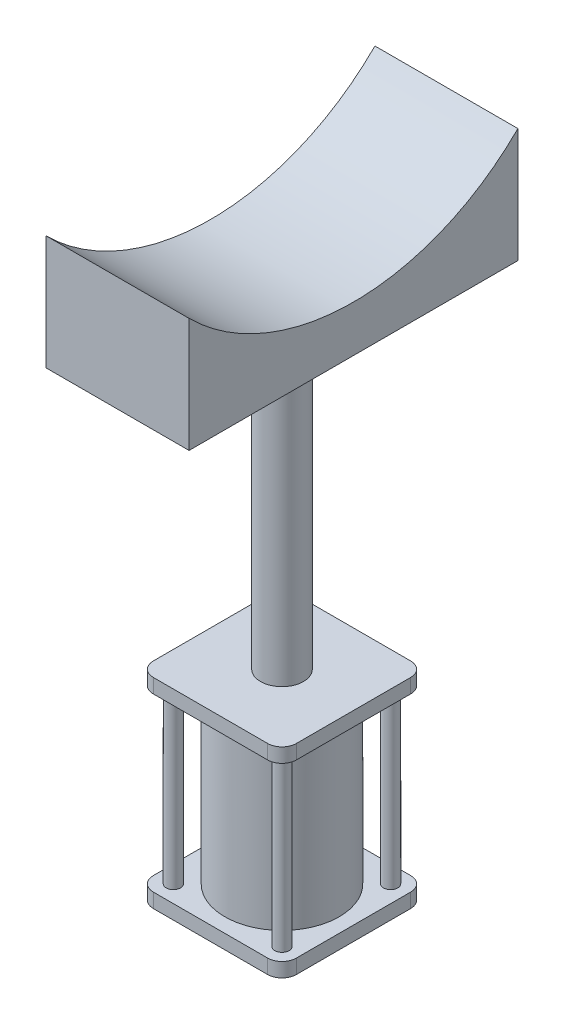
ISO-10303-21;
HEADER;
FILE_DESCRIPTION(('STEP AP214'),'2;1');
FILE_NAME('part.step','',(''),(''),'','','');
FILE_SCHEMA(('AUTOMOTIVE_DESIGN { 1 0 10303 214 1 1 1 1 }'));
ENDSEC;
DATA;
#1=APPLICATION_CONTEXT('core data for automotive mechanical design processes');
#2=APPLICATION_PROTOCOL_DEFINITION('international standard','automotive_design',2000,#1);
#3=PRODUCT_CONTEXT('',#1,'mechanical');
#4=PRODUCT('Part','Part','',(#3));
#5=PRODUCT_RELATED_PRODUCT_CATEGORY('part','',(#4));
#6=PRODUCT_DEFINITION_FORMATION('','',#4);
#7=PRODUCT_DEFINITION_CONTEXT('part definition',#1,'design');
#8=PRODUCT_DEFINITION('design','',#6,#7);
#9=PRODUCT_DEFINITION_SHAPE('','',#8);
#10=(LENGTH_UNIT() NAMED_UNIT(*) SI_UNIT(.MILLI.,.METRE.));
#11=(NAMED_UNIT(*) PLANE_ANGLE_UNIT() SI_UNIT($,.RADIAN.));
#12=(NAMED_UNIT(*) SI_UNIT($,.STERADIAN.) SOLID_ANGLE_UNIT());
#13=UNCERTAINTY_MEASURE_WITH_UNIT(LENGTH_MEASURE(1.E-05),#10,'distance_accuracy_value','');
#14=(GEOMETRIC_REPRESENTATION_CONTEXT(3) GLOBAL_UNCERTAINTY_ASSIGNED_CONTEXT((#13)) GLOBAL_UNIT_ASSIGNED_CONTEXT((#10,
#11,#12)) REPRESENTATION_CONTEXT('',''));
#15=CARTESIAN_POINT('',(0.,0.,0.));
#16=DIRECTION('',(0.,0.,1.));
#17=DIRECTION('',(1.,0.,0.));
#18=AXIS2_PLACEMENT_3D('',#15,#16,#17);
#19=CARTESIAN_POINT('',(0.,355.,0.));
#20=DIRECTION('',(0.,-1.,0.));
#21=DIRECTION('',(0.,0.,-1.));
#22=AXIS2_PLACEMENT_3D('',#19,#20,#21);
#23=CYLINDRICAL_SURFACE('',#22,15.);
#24=CARTESIAN_POINT('',(0.,355.,0.));
#25=DIRECTION('',(0.,1.,0.));
#26=DIRECTION('',(0.,0.,1.));
#27=AXIS2_PLACEMENT_3D('',#24,#25,#26);
#28=CIRCLE('',#27,15.);
#29=CARTESIAN_POINT('',(0.,355.,15.));
#30=VERTEX_POINT('',#29);
#31=EDGE_CURVE('E12',#30,#30,#28,.T.);
#32=ORIENTED_EDGE('',*,*,#31,.F.);
#33=EDGE_LOOP('',(#32));
#34=FACE_BOUND('',#33,.T.);
#35=CARTESIAN_POINT('',(0.,140.,0.));
#36=DIRECTION('',(0.,1.,0.));
#37=DIRECTION('',(0.,0.,1.));
#38=AXIS2_PLACEMENT_3D('',#35,#36,#37);
#39=CIRCLE('',#38,15.);
#40=CARTESIAN_POINT('',(0.,140.,15.));
#41=VERTEX_POINT('',#40);
#42=EDGE_CURVE('E52',#41,#41,#39,.T.);
#43=ORIENTED_EDGE('',*,*,#42,.T.);
#44=EDGE_LOOP('',(#43));
#45=FACE_BOUND('',#44,.T.);
#46=ADVANCED_FACE('F49',(#34,#45),#23,.T.);
#47=CARTESIAN_POINT('',(0.,140.,0.));
#48=DIRECTION('',(0.,1.,0.));
#49=DIRECTION('',(0.,0.,1.));
#50=AXIS2_PLACEMENT_3D('',#47,#48,#49);
#51=PLANE('',#50);
#52=ORIENTED_EDGE('',*,*,#42,.F.);
#53=EDGE_LOOP('',(#52));
#54=FACE_BOUND('',#53,.T.);
#55=ADVANCED_FACE('F141',(#54),#51,.F.);
#56=CARTESIAN_POINT('',(-50.,550.,0.));
#57=DIRECTION('',(1.,0.,0.));
#58=DIRECTION('',(0.,0.,-1.));
#59=AXIS2_PLACEMENT_3D('',#56,#57,#58);
#60=CYLINDRICAL_SURFACE('',#59,162.634559672906);
#61=DIRECTION('',(1.,0.,0.));
#62=VECTOR('',#61,1.);
#63=CARTESIAN_POINT('',(-50.,435.,115.));
#64=LINE('',#63,#62);
#65=CARTESIAN_POINT('',(-50.,435.,115.));
#66=VERTEX_POINT('',#65);
#67=CARTESIAN_POINT('',(50.,435.,115.));
#68=VERTEX_POINT('',#67);
#69=EDGE_CURVE('E89',#66,#68,#64,.T.);
#70=ORIENTED_EDGE('',*,*,#69,.T.);
#71=CARTESIAN_POINT('',(50.,550.,0.));
#72=DIRECTION('',(-1.,0.,0.));
#73=DIRECTION('',(0.,0.,-1.));
#74=AXIS2_PLACEMENT_3D('',#71,#72,#73);
#75=CIRCLE('',#74,162.634559672906);
#76=CARTESIAN_POINT('',(50.,435.,-115.));
#77=VERTEX_POINT('',#76);
#78=EDGE_CURVE('E93',#77,#68,#75,.T.);
#79=ORIENTED_EDGE('',*,*,#78,.F.);
#80=DIRECTION('',(1.,0.,0.));
#81=VECTOR('',#80,1.);
#82=CARTESIAN_POINT('',(-50.,435.,-115.));
#83=LINE('',#82,#81);
#84=CARTESIAN_POINT('',(-50.,435.,-115.));
#85=VERTEX_POINT('',#84);
#86=EDGE_CURVE('E64',#85,#77,#83,.T.);
#87=ORIENTED_EDGE('',*,*,#86,.F.);
#88=CARTESIAN_POINT('',(-50.,550.,0.));
#89=DIRECTION('',(-1.,0.,0.));
#90=DIRECTION('',(0.,0.,-1.));
#91=AXIS2_PLACEMENT_3D('',#88,#89,#90);
#92=CIRCLE('',#91,162.634559672906);
#93=EDGE_CURVE('E94',#85,#66,#92,.T.);
#94=ORIENTED_EDGE('',*,*,#93,.T.);
#95=EDGE_LOOP('',(#70,#79,#87,#94));
#96=FACE_BOUND('',#95,.T.);
#97=ADVANCED_FACE('F91',(#96),#60,.F.);
#98=CARTESIAN_POINT('',(-50.,435.,-115.));
#99=DIRECTION('',(0.,0.,-1.));
#100=DIRECTION('',(0.,1.,0.));
#101=AXIS2_PLACEMENT_3D('',#98,#99,#100);
#102=PLANE('',#101);
#103=ORIENTED_EDGE('',*,*,#86,.T.);
#104=DIRECTION('',(0.,1.,0.));
#105=VECTOR('',#104,1.);
#106=CARTESIAN_POINT('',(50.,435.,-115.));
#107=LINE('',#106,#105);
#108=CARTESIAN_POINT('',(50.,355.,-115.));
#109=VERTEX_POINT('',#108);
#110=EDGE_CURVE('E113',#109,#77,#107,.T.);
#111=ORIENTED_EDGE('',*,*,#110,.F.);
#112=DIRECTION('',(1.,0.,0.));
#113=VECTOR('',#112,1.);
#114=CARTESIAN_POINT('',(-50.,355.,-115.));
#115=LINE('',#114,#113);
#116=CARTESIAN_POINT('',(-50.,355.,-115.));
#117=VERTEX_POINT('',#116);
#118=EDGE_CURVE('E72',#117,#109,#115,.T.);
#119=ORIENTED_EDGE('',*,*,#118,.F.);
#120=DIRECTION('',(0.,1.,0.));
#121=VECTOR('',#120,1.);
#122=CARTESIAN_POINT('',(-50.,435.,-115.));
#123=LINE('',#122,#121);
#124=EDGE_CURVE('E100',#117,#85,#123,.T.);
#125=ORIENTED_EDGE('',*,*,#124,.T.);
#126=EDGE_LOOP('',(#103,#111,#119,#125));
#127=FACE_BOUND('',#126,.T.);
#128=ADVANCED_FACE('F147',(#127),#102,.T.);
#129=CARTESIAN_POINT('',(-50.,355.,115.));
#130=DIRECTION('',(0.,-1.,0.));
#131=DIRECTION('',(0.,0.,-1.));
#132=AXIS2_PLACEMENT_3D('',#129,#130,#131);
#133=PLANE('',#132);
#134=ORIENTED_EDGE('',*,*,#31,.T.);
#135=EDGE_LOOP('',(#134));
#136=FACE_BOUND('',#135,.T.);
#137=ORIENTED_EDGE('',*,*,#118,.T.);
#138=DIRECTION('',(0.,0.,-1.));
#139=VECTOR('',#138,1.);
#140=CARTESIAN_POINT('',(50.,355.,115.));
#141=LINE('',#140,#139);
#142=CARTESIAN_POINT('',(50.,355.,115.));
#143=VERTEX_POINT('',#142);
#144=EDGE_CURVE('E109',#143,#109,#141,.T.);
#145=ORIENTED_EDGE('',*,*,#144,.F.);
#146=DIRECTION('',(1.,0.,0.));
#147=VECTOR('',#146,1.);
#148=CARTESIAN_POINT('',(-50.,355.,115.));
#149=LINE('',#148,#147);
#150=CARTESIAN_POINT('',(-50.,355.,115.));
#151=VERTEX_POINT('',#150);
#152=EDGE_CURVE('E99',#151,#143,#149,.T.);
#153=ORIENTED_EDGE('',*,*,#152,.F.);
#154=DIRECTION('',(0.,0.,-1.));
#155=VECTOR('',#154,1.);
#156=CARTESIAN_POINT('',(-50.,355.,115.));
#157=LINE('',#156,#155);
#158=EDGE_CURVE('E126',#151,#117,#157,.T.);
#159=ORIENTED_EDGE('',*,*,#158,.T.);
#160=EDGE_LOOP('',(#137,#145,#153,#159));
#161=FACE_BOUND('',#160,.T.);
#162=ADVANCED_FACE('F154',(#136,#161),#133,.T.);
#163=CARTESIAN_POINT('',(-50.,435.,115.));
#164=DIRECTION('',(0.,0.,1.));
#165=DIRECTION('',(0.,-1.,0.));
#166=AXIS2_PLACEMENT_3D('',#163,#164,#165);
#167=PLANE('',#166);
#168=ORIENTED_EDGE('',*,*,#152,.T.);
#169=DIRECTION('',(0.,-1.,0.));
#170=VECTOR('',#169,1.);
#171=CARTESIAN_POINT('',(50.,435.,115.));
#172=LINE('',#171,#170);
#173=EDGE_CURVE('E103',#68,#143,#172,.T.);
#174=ORIENTED_EDGE('',*,*,#173,.F.);
#175=ORIENTED_EDGE('',*,*,#69,.F.);
#176=DIRECTION('',(0.,-1.,0.));
#177=VECTOR('',#176,1.);
#178=CARTESIAN_POINT('',(-50.,435.,115.));
#179=LINE('',#178,#177);
#180=EDGE_CURVE('E123',#66,#151,#179,.T.);
#181=ORIENTED_EDGE('',*,*,#180,.T.);
#182=EDGE_LOOP('',(#168,#174,#175,#181));
#183=FACE_BOUND('',#182,.T.);
#184=ADVANCED_FACE('F104',(#183),#167,.T.);
#185=CARTESIAN_POINT('',(-50.,550.,0.));
#186=DIRECTION('',(1.,0.,0.));
#187=DIRECTION('',(0.,0.,-1.));
#188=AXIS2_PLACEMENT_3D('',#185,#186,#187);
#189=PLANE('',#188);
#190=ORIENTED_EDGE('',*,*,#93,.F.);
#191=ORIENTED_EDGE('',*,*,#124,.F.);
#192=ORIENTED_EDGE('',*,*,#158,.F.);
#193=ORIENTED_EDGE('',*,*,#180,.F.);
#194=EDGE_LOOP('',(#190,#191,#192,#193));
#195=FACE_BOUND('',#194,.T.);
#196=ADVANCED_FACE('F153',(#195),#189,.F.);
#197=CARTESIAN_POINT('',(50.,550.,0.));
#198=DIRECTION('',(1.,0.,0.));
#199=DIRECTION('',(0.,0.,-1.));
#200=AXIS2_PLACEMENT_3D('',#197,#198,#199);
#201=PLANE('',#200);
#202=ORIENTED_EDGE('',*,*,#78,.T.);
#203=ORIENTED_EDGE('',*,*,#173,.T.);
#204=ORIENTED_EDGE('',*,*,#144,.T.);
#205=ORIENTED_EDGE('',*,*,#110,.T.);
#206=EDGE_LOOP('',(#202,#203,#204,#205));
#207=FACE_BOUND('',#206,.T.);
#208=ADVANCED_FACE('F112',(#207),#201,.T.);
#209=CLOSED_SHELL('',(#46,#55,#97,#128,#162,#184,#196,#208));
#210=MANIFOLD_SOLID_BREP('B2',#209);
#211=CARTESIAN_POINT('',(50.,10.,50.));
#212=DIRECTION('',(-1.,0.,0.));
#213=DIRECTION('',(0.,0.,1.));
#214=AXIS2_PLACEMENT_3D('',#211,#212,#213);
#215=PLANE('',#214);
#216=DIRECTION('',(0.,0.,-1.));
#217=VECTOR('',#216,1.);
#218=CARTESIAN_POINT('',(50.,0.,50.));
#219=LINE('',#218,#217);
#220=CARTESIAN_POINT('',(50.,0.,40.));
#221=VERTEX_POINT('',#220);
#222=CARTESIAN_POINT('',(50.,0.,-40.));
#223=VERTEX_POINT('',#222);
#224=EDGE_CURVE('E358',#221,#223,#219,.T.);
#225=ORIENTED_EDGE('',*,*,#224,.T.);
#226=DIRECTION('',(0.,-1.,0.));
#227=VECTOR('',#226,1.);
#228=CARTESIAN_POINT('',(50.,10.,-40.));
#229=LINE('',#228,#227);
#230=CARTESIAN_POINT('',(50.,10.,-40.));
#231=VERTEX_POINT('',#230);
#232=EDGE_CURVE('E336',#223,#231,#229,.F.);
#233=ORIENTED_EDGE('',*,*,#232,.T.);
#234=DIRECTION('',(0.,0.,-1.));
#235=VECTOR('',#234,1.);
#236=CARTESIAN_POINT('',(50.,10.,50.));
#237=LINE('',#236,#235);
#238=CARTESIAN_POINT('',(50.,10.,40.));
#239=VERTEX_POINT('',#238);
#240=EDGE_CURVE('E369',#239,#231,#237,.T.);
#241=ORIENTED_EDGE('',*,*,#240,.F.);
#242=DIRECTION('',(0.,-1.,0.));
#243=VECTOR('',#242,1.);
#244=CARTESIAN_POINT('',(50.,10.,40.));
#245=LINE('',#244,#243);
#246=EDGE_CURVE('E341',#239,#221,#245,.T.);
#247=ORIENTED_EDGE('',*,*,#246,.T.);
#248=EDGE_LOOP('',(#225,#233,#241,#247));
#249=FACE_BOUND('',#248,.T.);
#250=ADVANCED_FACE('F217',(#249),#215,.F.);
#251=CARTESIAN_POINT('',(-50.,10.,-50.));
#252=DIRECTION('',(0.,0.,1.));
#253=DIRECTION('',(1.,0.,0.));
#254=AXIS2_PLACEMENT_3D('',#251,#252,#253);
#255=PLANE('',#254);
#256=DIRECTION('',(-1.,0.,0.));
#257=VECTOR('',#256,1.);
#258=CARTESIAN_POINT('',(-50.,10.,-50.));
#259=LINE('',#258,#257);
#260=CARTESIAN_POINT('',(40.,10.,-50.));
#261=VERTEX_POINT('',#260);
#262=CARTESIAN_POINT('',(-40.,10.,-50.));
#263=VERTEX_POINT('',#262);
#264=EDGE_CURVE('E351',#261,#263,#259,.T.);
#265=ORIENTED_EDGE('',*,*,#264,.F.);
#266=DIRECTION('',(0.,-1.,0.));
#267=VECTOR('',#266,1.);
#268=CARTESIAN_POINT('',(40.,10.,-50.));
#269=LINE('',#268,#267);
#270=CARTESIAN_POINT('',(40.,0.,-50.));
#271=VERTEX_POINT('',#270);
#272=EDGE_CURVE('E335',#261,#271,#269,.T.);
#273=ORIENTED_EDGE('',*,*,#272,.T.);
#274=DIRECTION('',(-1.,0.,0.));
#275=VECTOR('',#274,1.);
#276=CARTESIAN_POINT('',(-50.,0.,-50.));
#277=LINE('',#276,#275);
#278=CARTESIAN_POINT('',(-40.,0.,-50.));
#279=VERTEX_POINT('',#278);
#280=EDGE_CURVE('E348',#271,#279,#277,.T.);
#281=ORIENTED_EDGE('',*,*,#280,.T.);
#282=DIRECTION('',(0.,-1.,0.));
#283=VECTOR('',#282,1.);
#284=CARTESIAN_POINT('',(-40.,10.,-50.));
#285=LINE('',#284,#283);
#286=EDGE_CURVE('E353',#279,#263,#285,.F.);
#287=ORIENTED_EDGE('',*,*,#286,.T.);
#288=EDGE_LOOP('',(#265,#273,#281,#287));
#289=FACE_BOUND('',#288,.T.);
#290=ADVANCED_FACE('F347',(#289),#255,.F.);
#291=CARTESIAN_POINT('',(-50.,10.,50.));
#292=DIRECTION('',(1.,0.,0.));
#293=DIRECTION('',(0.,0.,-1.));
#294=AXIS2_PLACEMENT_3D('',#291,#292,#293);
#295=PLANE('',#294);
#296=DIRECTION('',(0.,0.,1.));
#297=VECTOR('',#296,1.);
#298=CARTESIAN_POINT('',(-50.,0.,50.));
#299=LINE('',#298,#297);
#300=CARTESIAN_POINT('',(-50.,0.,-40.));
#301=VERTEX_POINT('',#300);
#302=CARTESIAN_POINT('',(-50.,0.,40.));
#303=VERTEX_POINT('',#302);
#304=EDGE_CURVE('E357',#301,#303,#299,.T.);
#305=ORIENTED_EDGE('',*,*,#304,.T.);
#306=DIRECTION('',(0.,-1.,0.));
#307=VECTOR('',#306,1.);
#308=CARTESIAN_POINT('',(-50.,10.,40.));
#309=LINE('',#308,#307);
#310=CARTESIAN_POINT('',(-50.,10.,40.));
#311=VERTEX_POINT('',#310);
#312=EDGE_CURVE('E419',#303,#311,#309,.F.);
#313=ORIENTED_EDGE('',*,*,#312,.T.);
#314=DIRECTION('',(0.,0.,1.));
#315=VECTOR('',#314,1.);
#316=CARTESIAN_POINT('',(-50.,10.,50.));
#317=LINE('',#316,#315);
#318=CARTESIAN_POINT('',(-50.,10.,-40.));
#319=VERTEX_POINT('',#318);
#320=EDGE_CURVE('E486',#319,#311,#317,.T.);
#321=ORIENTED_EDGE('',*,*,#320,.F.);
#322=DIRECTION('',(0.,-1.,0.));
#323=VECTOR('',#322,1.);
#324=CARTESIAN_POINT('',(-50.,10.,-40.));
#325=LINE('',#324,#323);
#326=EDGE_CURVE('E416',#319,#301,#325,.T.);
#327=ORIENTED_EDGE('',*,*,#326,.T.);
#328=EDGE_LOOP('',(#305,#313,#321,#327));
#329=FACE_BOUND('',#328,.T.);
#330=ADVANCED_FACE('F508',(#329),#295,.F.);
#331=CARTESIAN_POINT('',(-50.,10.,50.));
#332=DIRECTION('',(0.,0.,-1.));
#333=DIRECTION('',(-1.,0.,0.));
#334=AXIS2_PLACEMENT_3D('',#331,#332,#333);
#335=PLANE('',#334);
#336=DIRECTION('',(1.,0.,0.));
#337=VECTOR('',#336,1.);
#338=CARTESIAN_POINT('',(-50.,0.,50.));
#339=LINE('',#338,#337);
#340=CARTESIAN_POINT('',(-40.,0.,50.));
#341=VERTEX_POINT('',#340);
#342=CARTESIAN_POINT('',(40.,0.,50.));
#343=VERTEX_POINT('',#342);
#344=EDGE_CURVE('E361',#341,#343,#339,.T.);
#345=ORIENTED_EDGE('',*,*,#344,.T.);
#346=DIRECTION('',(0.,-1.,0.));
#347=VECTOR('',#346,1.);
#348=CARTESIAN_POINT('',(40.,10.,50.));
#349=LINE('',#348,#347);
#350=CARTESIAN_POINT('',(40.,10.,50.));
#351=VERTEX_POINT('',#350);
#352=EDGE_CURVE('E414',#343,#351,#349,.F.);
#353=ORIENTED_EDGE('',*,*,#352,.T.);
#354=DIRECTION('',(1.,0.,0.));
#355=VECTOR('',#354,1.);
#356=CARTESIAN_POINT('',(-50.,10.,50.));
#357=LINE('',#356,#355);
#358=CARTESIAN_POINT('',(-40.,10.,50.));
#359=VERTEX_POINT('',#358);
#360=EDGE_CURVE('E374',#359,#351,#357,.T.);
#361=ORIENTED_EDGE('',*,*,#360,.F.);
#362=DIRECTION('',(0.,-1.,0.));
#363=VECTOR('',#362,1.);
#364=CARTESIAN_POINT('',(-40.,10.,50.));
#365=LINE('',#364,#363);
#366=EDGE_CURVE('E411',#359,#341,#365,.T.);
#367=ORIENTED_EDGE('',*,*,#366,.T.);
#368=EDGE_LOOP('',(#345,#353,#361,#367));
#369=FACE_BOUND('',#368,.T.);
#370=ADVANCED_FACE('F503',(#369),#335,.F.);
#371=CARTESIAN_POINT('',(0.,10.,0.));
#372=DIRECTION('',(0.,-1.,0.));
#373=DIRECTION('',(0.,0.,-1.));
#374=AXIS2_PLACEMENT_3D('',#371,#372,#373);
#375=PLANE('',#374);
#376=CARTESIAN_POINT('',(-38.,10.,38.));
#377=DIRECTION('',(0.,-1.,0.));
#378=DIRECTION('',(0.,0.,-1.));
#379=AXIS2_PLACEMENT_3D('',#376,#377,#378);
#380=CIRCLE('',#379,5.);
#381=CARTESIAN_POINT('',(-38.,10.,33.));
#382=VERTEX_POINT('',#381);
#383=EDGE_CURVE('E392',#382,#382,#380,.F.);
#384=ORIENTED_EDGE('',*,*,#383,.F.);
#385=EDGE_LOOP('',(#384));
#386=FACE_BOUND('',#385,.T.);
#387=CARTESIAN_POINT('',(38.,10.,38.));
#388=DIRECTION('',(0.,-1.,0.));
#389=DIRECTION('',(0.,0.,-1.));
#390=AXIS2_PLACEMENT_3D('',#387,#388,#389);
#391=CIRCLE('',#390,5.);
#392=CARTESIAN_POINT('',(38.,10.,33.));
#393=VERTEX_POINT('',#392);
#394=EDGE_CURVE('E386',#393,#393,#391,.F.);
#395=ORIENTED_EDGE('',*,*,#394,.F.);
#396=EDGE_LOOP('',(#395));
#397=FACE_BOUND('',#396,.T.);
#398=CARTESIAN_POINT('',(38.,10.,-38.));
#399=DIRECTION('',(0.,-1.,0.));
#400=DIRECTION('',(0.,0.,-1.));
#401=AXIS2_PLACEMENT_3D('',#398,#399,#400);
#402=CIRCLE('',#401,5.);
#403=CARTESIAN_POINT('',(38.,10.,-43.));
#404=VERTEX_POINT('',#403);
#405=EDGE_CURVE('E380',#404,#404,#402,.F.);
#406=ORIENTED_EDGE('',*,*,#405,.F.);
#407=EDGE_LOOP('',(#406));
#408=FACE_BOUND('',#407,.T.);
#409=CARTESIAN_POINT('',(0.,9.99999999999999,0.));
#410=DIRECTION('',(0.,-1.,0.));
#411=DIRECTION('',(0.,0.,-1.));
#412=AXIS2_PLACEMENT_3D('',#409,#410,#411);
#413=CIRCLE('',#412,40.);
#414=CARTESIAN_POINT('',(0.,9.99999999999999,-40.));
#415=VERTEX_POINT('',#414);
#416=EDGE_CURVE('E373',#415,#415,#413,.F.);
#417=ORIENTED_EDGE('',*,*,#416,.F.);
#418=EDGE_LOOP('',(#417));
#419=FACE_BOUND('',#418,.T.);
#420=CARTESIAN_POINT('',(-38.,10.,-38.));
#421=DIRECTION('',(0.,-1.,0.));
#422=DIRECTION('',(0.,0.,-1.));
#423=AXIS2_PLACEMENT_3D('',#420,#421,#422);
#424=CIRCLE('',#423,5.);
#425=CARTESIAN_POINT('',(-38.,10.,-43.));
#426=VERTEX_POINT('',#425);
#427=EDGE_CURVE('E370',#426,#426,#424,.F.);
#428=ORIENTED_EDGE('',*,*,#427,.F.);
#429=EDGE_LOOP('',(#428));
#430=FACE_BOUND('',#429,.T.);
#431=ORIENTED_EDGE('',*,*,#240,.T.);
#432=CARTESIAN_POINT('',(40.,10.,-40.));
#433=DIRECTION('',(0.,-1.,0.));
#434=DIRECTION('',(0.,0.,-1.));
#435=AXIS2_PLACEMENT_3D('',#432,#433,#434);
#436=CIRCLE('',#435,10.);
#437=EDGE_CURVE('E409',#231,#261,#436,.F.);
#438=ORIENTED_EDGE('',*,*,#437,.T.);
#439=ORIENTED_EDGE('',*,*,#264,.T.);
#440=CARTESIAN_POINT('',(-40.,10.,-40.));
#441=DIRECTION('',(0.,-1.,0.));
#442=DIRECTION('',(0.,0.,-1.));
#443=AXIS2_PLACEMENT_3D('',#440,#441,#442);
#444=CIRCLE('',#443,10.);
#445=EDGE_CURVE('E403',#263,#319,#444,.F.);
#446=ORIENTED_EDGE('',*,*,#445,.T.);
#447=ORIENTED_EDGE('',*,*,#320,.T.);
#448=CARTESIAN_POINT('',(-40.,10.,40.));
#449=DIRECTION('',(0.,-1.,0.));
#450=DIRECTION('',(0.,0.,-1.));
#451=AXIS2_PLACEMENT_3D('',#448,#449,#450);
#452=CIRCLE('',#451,10.);
#453=EDGE_CURVE('E405',#311,#359,#452,.F.);
#454=ORIENTED_EDGE('',*,*,#453,.T.);
#455=ORIENTED_EDGE('',*,*,#360,.T.);
#456=CARTESIAN_POINT('',(40.,10.,40.));
#457=DIRECTION('',(0.,-1.,0.));
#458=DIRECTION('',(0.,0.,-1.));
#459=AXIS2_PLACEMENT_3D('',#456,#457,#458);
#460=CIRCLE('',#459,10.);
#461=EDGE_CURVE('E407',#351,#239,#460,.F.);
#462=ORIENTED_EDGE('',*,*,#461,.T.);
#463=EDGE_LOOP('',(#431,#438,#439,#446,#447,#454,#455,#462));
#464=FACE_BOUND('',#463,.T.);
#465=ADVANCED_FACE('F492',(#386,#397,#408,#419,#430,#464),#375,.F.);
#466=CARTESIAN_POINT('',(0.,0.,0.));
#467=DIRECTION('',(0.,-1.,0.));
#468=DIRECTION('',(0.,0.,-1.));
#469=AXIS2_PLACEMENT_3D('',#466,#467,#468);
#470=PLANE('',#469);
#471=ORIENTED_EDGE('',*,*,#280,.F.);
#472=CARTESIAN_POINT('',(40.,0.,-40.));
#473=DIRECTION('',(0.,-1.,0.));
#474=DIRECTION('',(0.,0.,-1.));
#475=AXIS2_PLACEMENT_3D('',#472,#473,#474);
#476=CIRCLE('',#475,10.);
#477=EDGE_CURVE('E331',#271,#223,#476,.T.);
#478=ORIENTED_EDGE('',*,*,#477,.T.);
#479=ORIENTED_EDGE('',*,*,#224,.F.);
#480=CARTESIAN_POINT('',(40.,0.,40.));
#481=DIRECTION('',(0.,-1.,0.));
#482=DIRECTION('',(0.,0.,-1.));
#483=AXIS2_PLACEMENT_3D('',#480,#481,#482);
#484=CIRCLE('',#483,10.);
#485=EDGE_CURVE('E342',#221,#343,#484,.T.);
#486=ORIENTED_EDGE('',*,*,#485,.T.);
#487=ORIENTED_EDGE('',*,*,#344,.F.);
#488=CARTESIAN_POINT('',(-40.,0.,40.));
#489=DIRECTION('',(0.,-1.,0.));
#490=DIRECTION('',(0.,0.,-1.));
#491=AXIS2_PLACEMENT_3D('',#488,#489,#490);
#492=CIRCLE('',#491,10.);
#493=EDGE_CURVE('E397',#341,#303,#492,.T.);
#494=ORIENTED_EDGE('',*,*,#493,.T.);
#495=ORIENTED_EDGE('',*,*,#304,.F.);
#496=CARTESIAN_POINT('',(-40.,0.,-40.));
#497=DIRECTION('',(0.,-1.,0.));
#498=DIRECTION('',(0.,0.,-1.));
#499=AXIS2_PLACEMENT_3D('',#496,#497,#498);
#500=CIRCLE('',#499,10.);
#501=EDGE_CURVE('E352',#301,#279,#500,.T.);
#502=ORIENTED_EDGE('',*,*,#501,.T.);
#503=EDGE_LOOP('',(#471,#478,#479,#486,#487,#494,#495,#502));
#504=FACE_BOUND('',#503,.T.);
#505=ADVANCED_FACE('F355',(#504),#470,.T.);
#506=CARTESIAN_POINT('',(-38.,144.142135623731,-38.));
#507=DIRECTION('',(0.,-1.,0.));
#508=DIRECTION('',(0.,0.,-1.));
#509=AXIS2_PLACEMENT_3D('',#506,#507,#508);
#510=CYLINDRICAL_SURFACE('',#509,5.);
#511=ORIENTED_EDGE('',*,*,#427,.T.);
#512=EDGE_LOOP('',(#511));
#513=FACE_BOUND('',#512,.T.);
#514=CARTESIAN_POINT('',(-38.,130.,-38.));
#515=DIRECTION('',(0.,1.,0.));
#516=DIRECTION('',(0.,0.,1.));
#517=AXIS2_PLACEMENT_3D('',#514,#515,#516);
#518=CIRCLE('',#517,5.);
#519=CARTESIAN_POINT('',(-38.,130.,-33.));
#520=VERTEX_POINT('',#519);
#521=EDGE_CURVE('E363',#520,#520,#518,.T.);
#522=ORIENTED_EDGE('',*,*,#521,.F.);
#523=EDGE_LOOP('',(#522));
#524=FACE_BOUND('',#523,.T.);
#525=ADVANCED_FACE('F622',(#513,#524),#510,.T.);
#526=CARTESIAN_POINT('',(0.,130.,0.));
#527=DIRECTION('',(0.,-1.,0.));
#528=DIRECTION('',(0.,0.,-1.));
#529=AXIS2_PLACEMENT_3D('',#526,#527,#528);
#530=CYLINDRICAL_SURFACE('',#529,40.);
#531=CARTESIAN_POINT('',(0.,130.,0.));
#532=DIRECTION('',(0.,1.,0.));
#533=DIRECTION('',(0.,0.,1.));
#534=AXIS2_PLACEMENT_3D('',#531,#532,#533);
#535=CIRCLE('',#534,40.);
#536=CARTESIAN_POINT('',(0.,130.,40.));
#537=VERTEX_POINT('',#536);
#538=EDGE_CURVE('E477',#537,#537,#535,.T.);
#539=ORIENTED_EDGE('',*,*,#538,.F.);
#540=EDGE_LOOP('',(#539));
#541=FACE_BOUND('',#540,.T.);
#542=ORIENTED_EDGE('',*,*,#416,.T.);
#543=EDGE_LOOP('',(#542));
#544=FACE_BOUND('',#543,.T.);
#545=ADVANCED_FACE('F619',(#541,#544),#530,.T.);
#546=CARTESIAN_POINT('',(-50.,140.,-50.));
#547=DIRECTION('',(1.,0.,0.));
#548=DIRECTION('',(0.,0.,-1.));
#549=AXIS2_PLACEMENT_3D('',#546,#547,#548);
#550=PLANE('',#549);
#551=DIRECTION('',(0.,0.,1.));
#552=VECTOR('',#551,1.);
#553=CARTESIAN_POINT('',(-50.,140.,-50.));
#554=LINE('',#553,#552);
#555=CARTESIAN_POINT('',(-50.,140.,-40.));
#556=VERTEX_POINT('',#555);
#557=CARTESIAN_POINT('',(-50.,140.,40.));
#558=VERTEX_POINT('',#557);
#559=EDGE_CURVE('E476',#556,#558,#554,.T.);
#560=ORIENTED_EDGE('',*,*,#559,.F.);
#561=DIRECTION('',(0.,-1.,0.));
#562=VECTOR('',#561,1.);
#563=CARTESIAN_POINT('',(-50.,140.,-40.));
#564=LINE('',#563,#562);
#565=CARTESIAN_POINT('',(-50.,130.,-40.));
#566=VERTEX_POINT('',#565);
#567=EDGE_CURVE('E423',#556,#566,#564,.T.);
#568=ORIENTED_EDGE('',*,*,#567,.T.);
#569=DIRECTION('',(0.,0.,1.));
#570=VECTOR('',#569,1.);
#571=CARTESIAN_POINT('',(-50.,130.,-50.));
#572=LINE('',#571,#570);
#573=CARTESIAN_POINT('',(-50.,130.,40.));
#574=VERTEX_POINT('',#573);
#575=EDGE_CURVE('E467',#566,#574,#572,.T.);
#576=ORIENTED_EDGE('',*,*,#575,.T.);
#577=DIRECTION('',(0.,-1.,0.));
#578=VECTOR('',#577,1.);
#579=CARTESIAN_POINT('',(-50.,140.,40.));
#580=LINE('',#579,#578);
#581=EDGE_CURVE('E421',#574,#558,#580,.F.);
#582=ORIENTED_EDGE('',*,*,#581,.T.);
#583=EDGE_LOOP('',(#560,#568,#576,#582));
#584=FACE_BOUND('',#583,.T.);
#585=ADVANCED_FACE('F602',(#584),#550,.F.);
#586=CARTESIAN_POINT('',(-50.,140.,50.));
#587=DIRECTION('',(0.,0.,-1.));
#588=DIRECTION('',(-1.,0.,0.));
#589=AXIS2_PLACEMENT_3D('',#586,#587,#588);
#590=PLANE('',#589);
#591=DIRECTION('',(1.,0.,0.));
#592=VECTOR('',#591,1.);
#593=CARTESIAN_POINT('',(-50.,130.,50.));
#594=LINE('',#593,#592);
#595=CARTESIAN_POINT('',(-40.,130.,50.));
#596=VERTEX_POINT('',#595);
#597=CARTESIAN_POINT('',(40.,130.,50.));
#598=VERTEX_POINT('',#597);
#599=EDGE_CURVE('E456',#596,#598,#594,.T.);
#600=ORIENTED_EDGE('',*,*,#599,.T.);
#601=DIRECTION('',(0.,-1.,0.));
#602=VECTOR('',#601,1.);
#603=CARTESIAN_POINT('',(40.,140.,50.));
#604=LINE('',#603,#602);
#605=CARTESIAN_POINT('',(40.,140.,50.));
#606=VERTEX_POINT('',#605);
#607=EDGE_CURVE('E47',#598,#606,#604,.F.);
#608=ORIENTED_EDGE('',*,*,#607,.T.);
#609=DIRECTION('',(1.,0.,0.));
#610=VECTOR('',#609,1.);
#611=CARTESIAN_POINT('',(-50.,140.,50.));
#612=LINE('',#611,#610);
#613=CARTESIAN_POINT('',(-40.,140.,50.));
#614=VERTEX_POINT('',#613);
#615=EDGE_CURVE('E458',#614,#606,#612,.T.);
#616=ORIENTED_EDGE('',*,*,#615,.F.);
#617=DIRECTION('',(0.,-1.,0.));
#618=VECTOR('',#617,1.);
#619=CARTESIAN_POINT('',(-40.,140.,50.));
#620=LINE('',#619,#618);
#621=EDGE_CURVE('E225',#614,#596,#620,.T.);
#622=ORIENTED_EDGE('',*,*,#621,.T.);
#623=EDGE_LOOP('',(#600,#608,#616,#622));
#624=FACE_BOUND('',#623,.T.);
#625=ADVANCED_FACE('F455',(#624),#590,.F.);
#626=CARTESIAN_POINT('',(50.,140.,-50.));
#627=DIRECTION('',(-1.,0.,0.));
#628=DIRECTION('',(0.,0.,1.));
#629=AXIS2_PLACEMENT_3D('',#626,#627,#628);
#630=PLANE('',#629);
#631=DIRECTION('',(0.,0.,-1.));
#632=VECTOR('',#631,1.);
#633=CARTESIAN_POINT('',(50.,130.,-50.));
#634=LINE('',#633,#632);
#635=CARTESIAN_POINT('',(50.,130.,40.));
#636=VERTEX_POINT('',#635);
#637=CARTESIAN_POINT('',(50.,130.,-40.));
#638=VERTEX_POINT('',#637);
#639=EDGE_CURVE('E466',#636,#638,#634,.T.);
#640=ORIENTED_EDGE('',*,*,#639,.T.);
#641=DIRECTION('',(0.,-1.,0.));
#642=VECTOR('',#641,1.);
#643=CARTESIAN_POINT('',(50.,140.,-40.));
#644=LINE('',#643,#642);
#645=CARTESIAN_POINT('',(50.,140.,-40.));
#646=VERTEX_POINT('',#645);
#647=EDGE_CURVE('E232',#638,#646,#644,.F.);
#648=ORIENTED_EDGE('',*,*,#647,.T.);
#649=DIRECTION('',(0.,0.,-1.));
#650=VECTOR('',#649,1.);
#651=CARTESIAN_POINT('',(50.,140.,-50.));
#652=LINE('',#651,#650);
#653=CARTESIAN_POINT('',(50.,140.,40.));
#654=VERTEX_POINT('',#653);
#655=EDGE_CURVE('E594',#654,#646,#652,.T.);
#656=ORIENTED_EDGE('',*,*,#655,.F.);
#657=DIRECTION('',(0.,-1.,0.));
#658=VECTOR('',#657,1.);
#659=CARTESIAN_POINT('',(50.,140.,40.));
#660=LINE('',#659,#658);
#661=EDGE_CURVE('E446',#654,#636,#660,.T.);
#662=ORIENTED_EDGE('',*,*,#661,.T.);
#663=EDGE_LOOP('',(#640,#648,#656,#662));
#664=FACE_BOUND('',#663,.T.);
#665=ADVANCED_FACE('F605',(#664),#630,.F.);
#666=CARTESIAN_POINT('',(-50.,140.,-50.));
#667=DIRECTION('',(0.,0.,1.));
#668=DIRECTION('',(1.,0.,0.));
#669=AXIS2_PLACEMENT_3D('',#666,#667,#668);
#670=PLANE('',#669);
#671=DIRECTION('',(-1.,0.,0.));
#672=VECTOR('',#671,1.);
#673=CARTESIAN_POINT('',(-50.,130.,-50.));
#674=LINE('',#673,#672);
#675=CARTESIAN_POINT('',(40.,130.,-50.));
#676=VERTEX_POINT('',#675);
#677=CARTESIAN_POINT('',(-40.,130.,-50.));
#678=VERTEX_POINT('',#677);
#679=EDGE_CURVE('E469',#676,#678,#674,.T.);
#680=ORIENTED_EDGE('',*,*,#679,.T.);
#681=DIRECTION('',(0.,-1.,0.));
#682=VECTOR('',#681,1.);
#683=CARTESIAN_POINT('',(-40.,140.,-50.));
#684=LINE('',#683,#682);
#685=CARTESIAN_POINT('',(-40.,140.,-50.));
#686=VERTEX_POINT('',#685);
#687=EDGE_CURVE('E437',#678,#686,#684,.F.);
#688=ORIENTED_EDGE('',*,*,#687,.T.);
#689=DIRECTION('',(-1.,0.,0.));
#690=VECTOR('',#689,1.);
#691=CARTESIAN_POINT('',(-50.,140.,-50.));
#692=LINE('',#691,#690);
#693=CARTESIAN_POINT('',(40.,140.,-50.));
#694=VERTEX_POINT('',#693);
#695=EDGE_CURVE('E480',#694,#686,#692,.T.);
#696=ORIENTED_EDGE('',*,*,#695,.F.);
#697=DIRECTION('',(0.,-1.,0.));
#698=VECTOR('',#697,1.);
#699=CARTESIAN_POINT('',(40.,140.,-50.));
#700=LINE('',#699,#698);
#701=EDGE_CURVE('E434',#694,#676,#700,.T.);
#702=ORIENTED_EDGE('',*,*,#701,.T.);
#703=EDGE_LOOP('',(#680,#688,#696,#702));
#704=FACE_BOUND('',#703,.T.);
#705=ADVANCED_FACE('F604',(#704),#670,.F.);
#706=CARTESIAN_POINT('',(0.,140.,0.));
#707=DIRECTION('',(0.,1.,0.));
#708=DIRECTION('',(0.,0.,1.));
#709=AXIS2_PLACEMENT_3D('',#706,#707,#708);
#710=PLANE('',#709);
#711=ORIENTED_EDGE('',*,*,#695,.T.);
#712=CARTESIAN_POINT('',(-40.,140.,-40.));
#713=DIRECTION('',(0.,1.,0.));
#714=DIRECTION('',(0.,0.,1.));
#715=AXIS2_PLACEMENT_3D('',#712,#713,#714);
#716=CIRCLE('',#715,10.);
#717=EDGE_CURVE('E444',#686,#556,#716,.T.);
#718=ORIENTED_EDGE('',*,*,#717,.T.);
#719=ORIENTED_EDGE('',*,*,#559,.T.);
#720=CARTESIAN_POINT('',(-40.,140.,40.));
#721=DIRECTION('',(0.,1.,0.));
#722=DIRECTION('',(0.,0.,1.));
#723=AXIS2_PLACEMENT_3D('',#720,#721,#722);
#724=CIRCLE('',#723,10.);
#725=EDGE_CURVE('E439',#558,#614,#724,.T.);
#726=ORIENTED_EDGE('',*,*,#725,.T.);
#727=ORIENTED_EDGE('',*,*,#615,.T.);
#728=CARTESIAN_POINT('',(40.,140.,40.));
#729=DIRECTION('',(0.,1.,0.));
#730=DIRECTION('',(0.,0.,1.));
#731=AXIS2_PLACEMENT_3D('',#728,#729,#730);
#732=CIRCLE('',#731,10.);
#733=EDGE_CURVE('E239',#606,#654,#732,.T.);
#734=ORIENTED_EDGE('',*,*,#733,.T.);
#735=ORIENTED_EDGE('',*,*,#655,.T.);
#736=CARTESIAN_POINT('',(40.,140.,-40.));
#737=DIRECTION('',(0.,1.,0.));
#738=DIRECTION('',(0.,0.,1.));
#739=AXIS2_PLACEMENT_3D('',#736,#737,#738);
#740=CIRCLE('',#739,10.);
#741=EDGE_CURVE('E442',#646,#694,#740,.T.);
#742=ORIENTED_EDGE('',*,*,#741,.T.);
#743=EDGE_LOOP('',(#711,#718,#719,#726,#727,#734,#735,#742));
#744=FACE_BOUND('',#743,.T.);
#745=ADVANCED_FACE('F588',(#744),#710,.T.);
#746=CARTESIAN_POINT('',(0.,130.,0.));
#747=DIRECTION('',(0.,1.,0.));
#748=DIRECTION('',(0.,0.,1.));
#749=AXIS2_PLACEMENT_3D('',#746,#747,#748);
#750=PLANE('',#749);
#751=CARTESIAN_POINT('',(-38.,130.,38.));
#752=DIRECTION('',(0.,1.,0.));
#753=DIRECTION('',(0.,0.,1.));
#754=AXIS2_PLACEMENT_3D('',#751,#752,#753);
#755=CIRCLE('',#754,5.);
#756=CARTESIAN_POINT('',(-38.,130.,43.));
#757=VERTEX_POINT('',#756);
#758=EDGE_CURVE('E389',#757,#757,#755,.F.);
#759=ORIENTED_EDGE('',*,*,#758,.F.);
#760=EDGE_LOOP('',(#759));
#761=FACE_BOUND('',#760,.T.);
#762=CARTESIAN_POINT('',(38.,130.,38.));
#763=DIRECTION('',(0.,1.,0.));
#764=DIRECTION('',(0.,0.,1.));
#765=AXIS2_PLACEMENT_3D('',#762,#763,#764);
#766=CIRCLE('',#765,5.);
#767=CARTESIAN_POINT('',(38.,130.,43.));
#768=VERTEX_POINT('',#767);
#769=EDGE_CURVE('E383',#768,#768,#766,.F.);
#770=ORIENTED_EDGE('',*,*,#769,.F.);
#771=EDGE_LOOP('',(#770));
#772=FACE_BOUND('',#771,.T.);
#773=CARTESIAN_POINT('',(38.,130.,-38.));
#774=DIRECTION('',(0.,1.,0.));
#775=DIRECTION('',(0.,0.,1.));
#776=AXIS2_PLACEMENT_3D('',#773,#774,#775);
#777=CIRCLE('',#776,5.);
#778=CARTESIAN_POINT('',(38.,130.,-33.));
#779=VERTEX_POINT('',#778);
#780=EDGE_CURVE('E377',#779,#779,#777,.F.);
#781=ORIENTED_EDGE('',*,*,#780,.F.);
#782=EDGE_LOOP('',(#781));
#783=FACE_BOUND('',#782,.T.);
#784=ORIENTED_EDGE('',*,*,#521,.T.);
#785=EDGE_LOOP('',(#784));
#786=FACE_BOUND('',#785,.T.);
#787=ORIENTED_EDGE('',*,*,#538,.T.);
#788=EDGE_LOOP('',(#787));
#789=FACE_BOUND('',#788,.T.);
#790=ORIENTED_EDGE('',*,*,#575,.F.);
#791=CARTESIAN_POINT('',(-40.,130.,-40.));
#792=DIRECTION('',(0.,1.,0.));
#793=DIRECTION('',(0.,0.,1.));
#794=AXIS2_PLACEMENT_3D('',#791,#792,#793);
#795=CIRCLE('',#794,10.);
#796=EDGE_CURVE('E432',#566,#678,#795,.F.);
#797=ORIENTED_EDGE('',*,*,#796,.T.);
#798=ORIENTED_EDGE('',*,*,#679,.F.);
#799=CARTESIAN_POINT('',(40.,130.,-40.));
#800=DIRECTION('',(0.,1.,0.));
#801=DIRECTION('',(0.,0.,1.));
#802=AXIS2_PLACEMENT_3D('',#799,#800,#801);
#803=CIRCLE('',#802,10.);
#804=EDGE_CURVE('E430',#676,#638,#803,.F.);
#805=ORIENTED_EDGE('',*,*,#804,.T.);
#806=ORIENTED_EDGE('',*,*,#639,.F.);
#807=CARTESIAN_POINT('',(40.,130.,40.));
#808=DIRECTION('',(0.,1.,0.));
#809=DIRECTION('',(0.,0.,1.));
#810=AXIS2_PLACEMENT_3D('',#807,#808,#809);
#811=CIRCLE('',#810,10.);
#812=EDGE_CURVE('E428',#636,#598,#811,.F.);
#813=ORIENTED_EDGE('',*,*,#812,.T.);
#814=ORIENTED_EDGE('',*,*,#599,.F.);
#815=CARTESIAN_POINT('',(-40.,130.,40.));
#816=DIRECTION('',(0.,1.,0.));
#817=DIRECTION('',(0.,0.,1.));
#818=AXIS2_PLACEMENT_3D('',#815,#816,#817);
#819=CIRCLE('',#818,10.);
#820=EDGE_CURVE('E426',#596,#574,#819,.F.);
#821=ORIENTED_EDGE('',*,*,#820,.T.);
#822=EDGE_LOOP('',(#790,#797,#798,#805,#806,#813,#814,#821));
#823=FACE_BOUND('',#822,.T.);
#824=ADVANCED_FACE('F463',(#761,#772,#783,#786,#789,#823),#750,.F.);
#825=CARTESIAN_POINT('',(38.,144.142135623731,-38.));
#826=DIRECTION('',(0.,-1.,0.));
#827=DIRECTION('',(0.,0.,-1.));
#828=AXIS2_PLACEMENT_3D('',#825,#826,#827);
#829=CYLINDRICAL_SURFACE('',#828,5.);
#830=ORIENTED_EDGE('',*,*,#405,.T.);
#831=EDGE_LOOP('',(#830));
#832=FACE_BOUND('',#831,.T.);
#833=ORIENTED_EDGE('',*,*,#780,.T.);
#834=EDGE_LOOP('',(#833));
#835=FACE_BOUND('',#834,.T.);
#836=ADVANCED_FACE('F693',(#832,#835),#829,.T.);
#837=CARTESIAN_POINT('',(38.,144.142135623731,38.));
#838=DIRECTION('',(0.,-1.,0.));
#839=DIRECTION('',(0.,0.,-1.));
#840=AXIS2_PLACEMENT_3D('',#837,#838,#839);
#841=CYLINDRICAL_SURFACE('',#840,5.);
#842=ORIENTED_EDGE('',*,*,#394,.T.);
#843=EDGE_LOOP('',(#842));
#844=FACE_BOUND('',#843,.T.);
#845=ORIENTED_EDGE('',*,*,#769,.T.);
#846=EDGE_LOOP('',(#845));
#847=FACE_BOUND('',#846,.T.);
#848=ADVANCED_FACE('F710',(#844,#847),#841,.T.);
#849=CARTESIAN_POINT('',(-38.,144.142135623731,38.));
#850=DIRECTION('',(0.,-1.,0.));
#851=DIRECTION('',(0.,0.,-1.));
#852=AXIS2_PLACEMENT_3D('',#849,#850,#851);
#853=CYLINDRICAL_SURFACE('',#852,5.);
#854=ORIENTED_EDGE('',*,*,#383,.T.);
#855=EDGE_LOOP('',(#854));
#856=FACE_BOUND('',#855,.T.);
#857=ORIENTED_EDGE('',*,*,#758,.T.);
#858=EDGE_LOOP('',(#857));
#859=FACE_BOUND('',#858,.T.);
#860=ADVANCED_FACE('F535',(#856,#859),#853,.T.);
#861=CARTESIAN_POINT('',(40.,10.,-40.));
#862=DIRECTION('',(0.,-1.,0.));
#863=DIRECTION('',(0.,0.,-1.));
#864=AXIS2_PLACEMENT_3D('',#861,#862,#863);
#865=CYLINDRICAL_SURFACE('',#864,10.);
#866=ORIENTED_EDGE('',*,*,#437,.F.);
#867=ORIENTED_EDGE('',*,*,#232,.F.);
#868=ORIENTED_EDGE('',*,*,#477,.F.);
#869=ORIENTED_EDGE('',*,*,#272,.F.);
#870=EDGE_LOOP('',(#866,#867,#868,#869));
#871=FACE_BOUND('',#870,.T.);
#872=ADVANCED_FACE('F334',(#871),#865,.T.);
#873=CARTESIAN_POINT('',(40.,10.,40.));
#874=DIRECTION('',(0.,-1.,0.));
#875=DIRECTION('',(0.,0.,-1.));
#876=AXIS2_PLACEMENT_3D('',#873,#874,#875);
#877=CYLINDRICAL_SURFACE('',#876,10.);
#878=ORIENTED_EDGE('',*,*,#461,.F.);
#879=ORIENTED_EDGE('',*,*,#352,.F.);
#880=ORIENTED_EDGE('',*,*,#485,.F.);
#881=ORIENTED_EDGE('',*,*,#246,.F.);
#882=EDGE_LOOP('',(#878,#879,#880,#881));
#883=FACE_BOUND('',#882,.T.);
#884=ADVANCED_FACE('F500',(#883),#877,.T.);
#885=CARTESIAN_POINT('',(-40.,10.,40.));
#886=DIRECTION('',(0.,-1.,0.));
#887=DIRECTION('',(0.,0.,-1.));
#888=AXIS2_PLACEMENT_3D('',#885,#886,#887);
#889=CYLINDRICAL_SURFACE('',#888,10.);
#890=ORIENTED_EDGE('',*,*,#453,.F.);
#891=ORIENTED_EDGE('',*,*,#312,.F.);
#892=ORIENTED_EDGE('',*,*,#493,.F.);
#893=ORIENTED_EDGE('',*,*,#366,.F.);
#894=EDGE_LOOP('',(#890,#891,#892,#893));
#895=FACE_BOUND('',#894,.T.);
#896=ADVANCED_FACE('F505',(#895),#889,.T.);
#897=CARTESIAN_POINT('',(-40.,10.,-40.));
#898=DIRECTION('',(0.,-1.,0.));
#899=DIRECTION('',(0.,0.,-1.));
#900=AXIS2_PLACEMENT_3D('',#897,#898,#899);
#901=CYLINDRICAL_SURFACE('',#900,10.);
#902=ORIENTED_EDGE('',*,*,#445,.F.);
#903=ORIENTED_EDGE('',*,*,#286,.F.);
#904=ORIENTED_EDGE('',*,*,#501,.F.);
#905=ORIENTED_EDGE('',*,*,#326,.F.);
#906=EDGE_LOOP('',(#902,#903,#904,#905));
#907=FACE_BOUND('',#906,.T.);
#908=ADVANCED_FACE('F513',(#907),#901,.T.);
#909=CARTESIAN_POINT('',(-40.,140.,-40.));
#910=DIRECTION('',(0.,-1.,0.));
#911=DIRECTION('',(0.,0.,-1.));
#912=AXIS2_PLACEMENT_3D('',#909,#910,#911);
#913=CYLINDRICAL_SURFACE('',#912,10.);
#914=ORIENTED_EDGE('',*,*,#717,.F.);
#915=ORIENTED_EDGE('',*,*,#687,.F.);
#916=ORIENTED_EDGE('',*,*,#796,.F.);
#917=ORIENTED_EDGE('',*,*,#567,.F.);
#918=EDGE_LOOP('',(#914,#915,#916,#917));
#919=FACE_BOUND('',#918,.T.);
#920=ADVANCED_FACE('F515',(#919),#913,.T.);
#921=CARTESIAN_POINT('',(40.,140.,-40.));
#922=DIRECTION('',(0.,-1.,0.));
#923=DIRECTION('',(0.,0.,-1.));
#924=AXIS2_PLACEMENT_3D('',#921,#922,#923);
#925=CYLINDRICAL_SURFACE('',#924,10.);
#926=ORIENTED_EDGE('',*,*,#741,.F.);
#927=ORIENTED_EDGE('',*,*,#647,.F.);
#928=ORIENTED_EDGE('',*,*,#804,.F.);
#929=ORIENTED_EDGE('',*,*,#701,.F.);
#930=EDGE_LOOP('',(#926,#927,#928,#929));
#931=FACE_BOUND('',#930,.T.);
#932=ADVANCED_FACE('F521',(#931),#925,.T.);
#933=CARTESIAN_POINT('',(40.,140.,40.));
#934=DIRECTION('',(0.,-1.,0.));
#935=DIRECTION('',(0.,0.,-1.));
#936=AXIS2_PLACEMENT_3D('',#933,#934,#935);
#937=CYLINDRICAL_SURFACE('',#936,10.);
#938=ORIENTED_EDGE('',*,*,#733,.F.);
#939=ORIENTED_EDGE('',*,*,#607,.F.);
#940=ORIENTED_EDGE('',*,*,#812,.F.);
#941=ORIENTED_EDGE('',*,*,#661,.F.);
#942=EDGE_LOOP('',(#938,#939,#940,#941));
#943=FACE_BOUND('',#942,.T.);
#944=ADVANCED_FACE('F565',(#943),#937,.T.);
#945=CARTESIAN_POINT('',(-40.,140.,40.));
#946=DIRECTION('',(0.,-1.,0.));
#947=DIRECTION('',(0.,0.,-1.));
#948=AXIS2_PLACEMENT_3D('',#945,#946,#947);
#949=CYLINDRICAL_SURFACE('',#948,10.);
#950=ORIENTED_EDGE('',*,*,#725,.F.);
#951=ORIENTED_EDGE('',*,*,#581,.F.);
#952=ORIENTED_EDGE('',*,*,#820,.F.);
#953=ORIENTED_EDGE('',*,*,#621,.F.);
#954=EDGE_LOOP('',(#950,#951,#952,#953));
#955=FACE_BOUND('',#954,.T.);
#956=ADVANCED_FACE('F219',(#955),#949,.T.);
#957=CLOSED_SHELL('',(#250,#290,#330,#370,#465,#505,#525,#545,#585,#625,#665,#705,#745,#824,
#836,#848,#860,#872,#884,#896,#908,#920,#932,#944,#956));
#958=MANIFOLD_SOLID_BREP('B6',#957);
#959=ADVANCED_BREP_SHAPE_REPRESENTATION('',(#18,#210,#958),#14);
#960=SHAPE_DEFINITION_REPRESENTATION(#9,#959);
ENDSEC;
END-ISO-10303-21;
